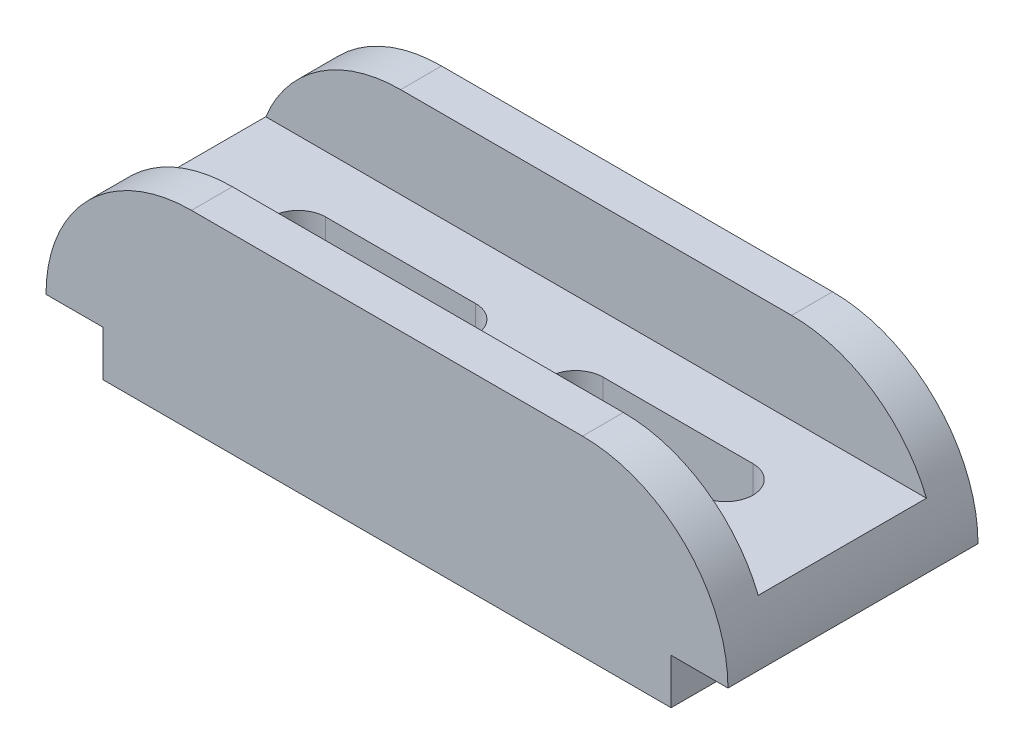
ISO-10303-21;
HEADER;
FILE_DESCRIPTION(('STEP AP214'),'2;1');
FILE_NAME('part.step','',(''),(''),'','','');
FILE_SCHEMA(('AUTOMOTIVE_DESIGN { 1 0 10303 214 1 1 1 1 }'));
ENDSEC;
DATA;
#1=APPLICATION_CONTEXT('core data for automotive mechanical design processes');
#2=APPLICATION_PROTOCOL_DEFINITION('international standard','automotive_design',2000,#1);
#3=PRODUCT_CONTEXT('',#1,'mechanical');
#4=PRODUCT('Part','Part','',(#3));
#5=PRODUCT_RELATED_PRODUCT_CATEGORY('part','',(#4));
#6=PRODUCT_DEFINITION_FORMATION('','',#4);
#7=PRODUCT_DEFINITION_CONTEXT('part definition',#1,'design');
#8=PRODUCT_DEFINITION('design','',#6,#7);
#9=PRODUCT_DEFINITION_SHAPE('','',#8);
#10=(LENGTH_UNIT() NAMED_UNIT(*) SI_UNIT(.MILLI.,.METRE.));
#11=(NAMED_UNIT(*) PLANE_ANGLE_UNIT() SI_UNIT($,.RADIAN.));
#12=(NAMED_UNIT(*) SI_UNIT($,.STERADIAN.) SOLID_ANGLE_UNIT());
#13=UNCERTAINTY_MEASURE_WITH_UNIT(LENGTH_MEASURE(1.E-05),#10,'distance_accuracy_value','');
#14=(GEOMETRIC_REPRESENTATION_CONTEXT(3) GLOBAL_UNCERTAINTY_ASSIGNED_CONTEXT((#13)) GLOBAL_UNIT_ASSIGNED_CONTEXT((#10,
#11,#12)) REPRESENTATION_CONTEXT('',''));
#15=CARTESIAN_POINT('',(0.,0.,0.));
#16=DIRECTION('',(0.,0.,1.));
#17=DIRECTION('',(1.,0.,0.));
#18=AXIS2_PLACEMENT_3D('',#15,#16,#17);
#19=CARTESIAN_POINT('',(43.,42.,27.5));
#20=DIRECTION('',(0.,-1.,0.));
#21=DIRECTION('',(0.,0.,-1.));
#22=AXIS2_PLACEMENT_3D('',#19,#20,#21);
#23=PLANE('',#22);
#24=DIRECTION('',(1.,0.,0.));
#25=VECTOR('',#24,1.);
#26=CARTESIAN_POINT('',(-75.,42.,18.5));
#27=LINE('',#26,#25);
#28=CARTESIAN_POINT('',(-43.,42.,18.5));
#29=VERTEX_POINT('',#28);
#30=CARTESIAN_POINT('',(43.,42.,18.5));
#31=VERTEX_POINT('',#30);
#32=EDGE_CURVE('E218',#29,#31,#27,.T.);
#33=ORIENTED_EDGE('',*,*,#32,.F.);
#34=DIRECTION('',(0.,0.,-1.));
#35=VECTOR('',#34,1.);
#36=CARTESIAN_POINT('',(-43.,42.,27.5));
#37=LINE('',#36,#35);
#38=CARTESIAN_POINT('',(-43.,42.,27.5));
#39=VERTEX_POINT('',#38);
#40=EDGE_CURVE('E314',#39,#29,#37,.T.);
#41=ORIENTED_EDGE('',*,*,#40,.F.);
#42=DIRECTION('',(-1.,0.,0.));
#43=VECTOR('',#42,1.);
#44=CARTESIAN_POINT('',(43.,42.,27.5));
#45=LINE('',#44,#43);
#46=CARTESIAN_POINT('',(43.,42.,27.5));
#47=VERTEX_POINT('',#46);
#48=EDGE_CURVE('E273',#47,#39,#45,.T.);
#49=ORIENTED_EDGE('',*,*,#48,.F.);
#50=DIRECTION('',(0.,0.,-1.));
#51=VECTOR('',#50,1.);
#52=CARTESIAN_POINT('',(43.,42.,27.5));
#53=LINE('',#52,#51);
#54=EDGE_CURVE('E318',#47,#31,#53,.T.);
#55=ORIENTED_EDGE('',*,*,#54,.T.);
#56=EDGE_LOOP('',(#33,#41,#49,#55));
#57=FACE_BOUND('',#56,.T.);
#58=ADVANCED_FACE('F39',(#57),#23,.F.);
#59=CARTESIAN_POINT('',(62.5,0.,27.5));
#60=DIRECTION('',(-1.,0.,0.));
#61=DIRECTION('',(0.,0.,1.));
#62=AXIS2_PLACEMENT_3D('',#59,#60,#61);
#63=PLANE('',#62);
#64=DIRECTION('',(0.,1.,0.));
#65=VECTOR('',#64,1.);
#66=CARTESIAN_POINT('',(62.5,0.,-27.5));
#67=LINE('',#66,#65);
#68=CARTESIAN_POINT('',(62.5,0.,-27.5));
#69=VERTEX_POINT('',#68);
#70=CARTESIAN_POINT('',(62.5,10.,-27.5));
#71=VERTEX_POINT('',#70);
#72=EDGE_CURVE('E264',#69,#71,#67,.T.);
#73=ORIENTED_EDGE('',*,*,#72,.T.);
#74=DIRECTION('',(0.,0.,-1.));
#75=VECTOR('',#74,1.);
#76=CARTESIAN_POINT('',(62.5,10.,27.5));
#77=LINE('',#76,#75);
#78=CARTESIAN_POINT('',(62.5,10.,27.5));
#79=VERTEX_POINT('',#78);
#80=EDGE_CURVE('E322',#79,#71,#77,.T.);
#81=ORIENTED_EDGE('',*,*,#80,.F.);
#82=DIRECTION('',(0.,1.,0.));
#83=VECTOR('',#82,1.);
#84=CARTESIAN_POINT('',(62.5,0.,27.5));
#85=LINE('',#84,#83);
#86=CARTESIAN_POINT('',(62.5,0.,27.5));
#87=VERTEX_POINT('',#86);
#88=EDGE_CURVE('E266',#87,#79,#85,.T.);
#89=ORIENTED_EDGE('',*,*,#88,.F.);
#90=DIRECTION('',(0.,0.,-1.));
#91=VECTOR('',#90,1.);
#92=CARTESIAN_POINT('',(62.5,0.,27.5));
#93=LINE('',#92,#91);
#94=EDGE_CURVE('E281',#87,#69,#93,.T.);
#95=ORIENTED_EDGE('',*,*,#94,.T.);
#96=EDGE_LOOP('',(#73,#81,#89,#95));
#97=FACE_BOUND('',#96,.T.);
#98=ADVANCED_FACE('F41',(#97),#63,.F.);
#99=CARTESIAN_POINT('',(62.5,10.,27.5));
#100=DIRECTION('',(0.,1.,0.));
#101=DIRECTION('',(0.,0.,1.));
#102=AXIS2_PLACEMENT_3D('',#99,#100,#101);
#103=PLANE('',#102);
#104=DIRECTION('',(1.,0.,0.));
#105=VECTOR('',#104,1.);
#106=CARTESIAN_POINT('',(62.5,10.,-27.5));
#107=LINE('',#106,#105);
#108=CARTESIAN_POINT('',(75.,10.,-27.5));
#109=VERTEX_POINT('',#108);
#110=EDGE_CURVE('E287',#71,#109,#107,.T.);
#111=ORIENTED_EDGE('',*,*,#110,.T.);
#112=DIRECTION('',(0.,0.,-1.));
#113=VECTOR('',#112,1.);
#114=CARTESIAN_POINT('',(75.,10.,27.5));
#115=LINE('',#114,#113);
#116=CARTESIAN_POINT('',(75.,10.,27.5));
#117=VERTEX_POINT('',#116);
#118=EDGE_CURVE('E321',#117,#109,#115,.T.);
#119=ORIENTED_EDGE('',*,*,#118,.F.);
#120=DIRECTION('',(1.,0.,0.));
#121=VECTOR('',#120,1.);
#122=CARTESIAN_POINT('',(62.5,10.,27.5));
#123=LINE('',#122,#121);
#124=EDGE_CURVE('E267',#79,#117,#123,.T.);
#125=ORIENTED_EDGE('',*,*,#124,.F.);
#126=ORIENTED_EDGE('',*,*,#80,.T.);
#127=EDGE_LOOP('',(#111,#119,#125,#126));
#128=FACE_BOUND('',#127,.T.);
#129=ADVANCED_FACE('F379',(#128),#103,.F.);
#130=CARTESIAN_POINT('',(43.,10.,27.5));
#131=DIRECTION('',(0.,0.,-1.));
#132=DIRECTION('',(-1.,0.,0.));
#133=AXIS2_PLACEMENT_3D('',#130,#131,#132);
#134=CYLINDRICAL_SURFACE('',#133,32.);
#135=CARTESIAN_POINT('',(43.,42.,-18.5));
#136=VERTEX_POINT('',#135);
#137=CARTESIAN_POINT('',(43.,42.,-27.5));
#138=VERTEX_POINT('',#137);
#139=EDGE_CURVE('E320',#136,#138,#53,.T.);
#140=ORIENTED_EDGE('',*,*,#139,.F.);
#141=CARTESIAN_POINT('',(43.,10.,-18.5));
#142=DIRECTION('',(0.,0.,-1.));
#143=DIRECTION('',(0.,1.,0.));
#144=AXIS2_PLACEMENT_3D('',#141,#142,#143);
#145=CIRCLE('',#144,32.);
#146=CARTESIAN_POINT('',(72.6647939483826,22.,-18.5));
#147=VERTEX_POINT('',#146);
#148=EDGE_CURVE('E265',#136,#147,#145,.T.);
#149=ORIENTED_EDGE('',*,*,#148,.T.);
#150=DIRECTION('',(0.,0.,-1.));
#151=VECTOR('',#150,1.);
#152=CARTESIAN_POINT('',(72.6647939483826,22.,27.5));
#153=LINE('',#152,#151);
#154=CARTESIAN_POINT('',(72.6647939483826,22.,18.5));
#155=VERTEX_POINT('',#154);
#156=EDGE_CURVE('E259',#147,#155,#153,.F.);
#157=ORIENTED_EDGE('',*,*,#156,.T.);
#158=CARTESIAN_POINT('',(43.,10.,18.5));
#159=DIRECTION('',(0.,0.,1.));
#160=DIRECTION('',(0.,-1.,0.));
#161=AXIS2_PLACEMENT_3D('',#158,#159,#160);
#162=CIRCLE('',#161,32.);
#163=EDGE_CURVE('E248',#155,#31,#162,.T.);
#164=ORIENTED_EDGE('',*,*,#163,.T.);
#165=ORIENTED_EDGE('',*,*,#54,.F.);
#166=CARTESIAN_POINT('',(43.,10.,27.5));
#167=DIRECTION('',(0.,0.,1.));
#168=DIRECTION('',(1.,0.,0.));
#169=AXIS2_PLACEMENT_3D('',#166,#167,#168);
#170=CIRCLE('',#169,32.);
#171=EDGE_CURVE('E275',#117,#47,#170,.T.);
#172=ORIENTED_EDGE('',*,*,#171,.F.);
#173=ORIENTED_EDGE('',*,*,#118,.T.);
#174=CARTESIAN_POINT('',(43.,10.,-27.5));
#175=DIRECTION('',(0.,0.,1.));
#176=DIRECTION('',(1.,0.,0.));
#177=AXIS2_PLACEMENT_3D('',#174,#175,#176);
#178=CIRCLE('',#177,32.);
#179=EDGE_CURVE('E288',#109,#138,#178,.T.);
#180=ORIENTED_EDGE('',*,*,#179,.T.);
#181=EDGE_LOOP('',(#140,#149,#157,#164,#165,#172,#173,#180));
#182=FACE_BOUND('',#181,.T.);
#183=ADVANCED_FACE('F338',(#182),#134,.T.);
#184=CARTESIAN_POINT('',(-43.,42.,-18.5));
#185=VERTEX_POINT('',#184);
#186=CARTESIAN_POINT('',(-43.,42.,-27.5));
#187=VERTEX_POINT('',#186);
#188=EDGE_CURVE('E311',#185,#187,#37,.T.);
#189=ORIENTED_EDGE('',*,*,#188,.F.);
#190=DIRECTION('',(1.,0.,0.));
#191=VECTOR('',#190,1.);
#192=CARTESIAN_POINT('',(-75.,42.,-18.5));
#193=LINE('',#192,#191);
#194=EDGE_CURVE('E246',#185,#136,#193,.T.);
#195=ORIENTED_EDGE('',*,*,#194,.T.);
#196=ORIENTED_EDGE('',*,*,#139,.T.);
#197=DIRECTION('',(-1.,0.,0.));
#198=VECTOR('',#197,1.);
#199=CARTESIAN_POINT('',(43.,42.,-27.5));
#200=LINE('',#199,#198);
#201=EDGE_CURVE('E295',#138,#187,#200,.T.);
#202=ORIENTED_EDGE('',*,*,#201,.T.);
#203=EDGE_LOOP('',(#189,#195,#196,#202));
#204=FACE_BOUND('',#203,.T.);
#205=ADVANCED_FACE('F343',(#204),#23,.F.);
#206=CARTESIAN_POINT('',(-43.,10.,27.5));
#207=DIRECTION('',(0.,0.,-1.));
#208=DIRECTION('',(-1.,0.,0.));
#209=AXIS2_PLACEMENT_3D('',#206,#207,#208);
#210=CYLINDRICAL_SURFACE('',#209,32.);
#211=DIRECTION('',(0.,0.,-1.));
#212=VECTOR('',#211,1.);
#213=CARTESIAN_POINT('',(-72.6647939483826,22.,27.5));
#214=LINE('',#213,#212);
#215=CARTESIAN_POINT('',(-72.6647939483826,22.,18.5));
#216=VERTEX_POINT('',#215);
#217=CARTESIAN_POINT('',(-72.6647939483826,22.,-18.5));
#218=VERTEX_POINT('',#217);
#219=EDGE_CURVE('E50',#216,#218,#214,.T.);
#220=ORIENTED_EDGE('',*,*,#219,.T.);
#221=CARTESIAN_POINT('',(-43.,10.,-18.5));
#222=DIRECTION('',(0.,0.,-1.));
#223=DIRECTION('',(0.,1.,0.));
#224=AXIS2_PLACEMENT_3D('',#221,#222,#223);
#225=CIRCLE('',#224,32.);
#226=EDGE_CURVE('E11',#218,#185,#225,.T.);
#227=ORIENTED_EDGE('',*,*,#226,.T.);
#228=ORIENTED_EDGE('',*,*,#188,.T.);
#229=CARTESIAN_POINT('',(-43.,10.,-27.5));
#230=DIRECTION('',(0.,0.,1.));
#231=DIRECTION('',(-1.,0.,0.));
#232=AXIS2_PLACEMENT_3D('',#229,#230,#231);
#233=CIRCLE('',#232,32.);
#234=CARTESIAN_POINT('',(-75.,10.,-27.5));
#235=VERTEX_POINT('',#234);
#236=EDGE_CURVE('E293',#187,#235,#233,.T.);
#237=ORIENTED_EDGE('',*,*,#236,.T.);
#238=DIRECTION('',(0.,0.,-1.));
#239=VECTOR('',#238,1.);
#240=CARTESIAN_POINT('',(-75.,10.,27.5));
#241=LINE('',#240,#239);
#242=CARTESIAN_POINT('',(-75.,10.,27.5));
#243=VERTEX_POINT('',#242);
#244=EDGE_CURVE('E309',#243,#235,#241,.T.);
#245=ORIENTED_EDGE('',*,*,#244,.F.);
#246=CARTESIAN_POINT('',(-43.,10.,27.5));
#247=DIRECTION('',(0.,0.,1.));
#248=DIRECTION('',(-1.,0.,0.));
#249=AXIS2_PLACEMENT_3D('',#246,#247,#248);
#250=CIRCLE('',#249,32.);
#251=EDGE_CURVE('E277',#39,#243,#250,.T.);
#252=ORIENTED_EDGE('',*,*,#251,.F.);
#253=ORIENTED_EDGE('',*,*,#40,.T.);
#254=CARTESIAN_POINT('',(-43.,10.,18.5));
#255=DIRECTION('',(0.,0.,1.));
#256=DIRECTION('',(0.,-1.,0.));
#257=AXIS2_PLACEMENT_3D('',#254,#255,#256);
#258=CIRCLE('',#257,32.);
#259=EDGE_CURVE('E330',#29,#216,#258,.T.);
#260=ORIENTED_EDGE('',*,*,#259,.T.);
#261=EDGE_LOOP('',(#220,#227,#228,#237,#245,#252,#253,#260));
#262=FACE_BOUND('',#261,.T.);
#263=ADVANCED_FACE('F335',(#262),#210,.T.);
#264=CARTESIAN_POINT('',(-62.5,10.,27.5));
#265=DIRECTION('',(0.,1.,0.));
#266=DIRECTION('',(0.,0.,1.));
#267=AXIS2_PLACEMENT_3D('',#264,#265,#266);
#268=PLANE('',#267);
#269=DIRECTION('',(1.,0.,0.));
#270=VECTOR('',#269,1.);
#271=CARTESIAN_POINT('',(-62.5,10.,-27.5));
#272=LINE('',#271,#270);
#273=CARTESIAN_POINT('',(-62.5,10.,-27.5));
#274=VERTEX_POINT('',#273);
#275=EDGE_CURVE('E300',#235,#274,#272,.T.);
#276=ORIENTED_EDGE('',*,*,#275,.T.);
#277=DIRECTION('',(0.,0.,-1.));
#278=VECTOR('',#277,1.);
#279=CARTESIAN_POINT('',(-62.5,10.,27.5));
#280=LINE('',#279,#278);
#281=CARTESIAN_POINT('',(-62.5,10.,27.5));
#282=VERTEX_POINT('',#281);
#283=EDGE_CURVE('E307',#282,#274,#280,.T.);
#284=ORIENTED_EDGE('',*,*,#283,.F.);
#285=DIRECTION('',(1.,0.,0.));
#286=VECTOR('',#285,1.);
#287=CARTESIAN_POINT('',(-62.5,10.,27.5));
#288=LINE('',#287,#286);
#289=EDGE_CURVE('E279',#243,#282,#288,.T.);
#290=ORIENTED_EDGE('',*,*,#289,.F.);
#291=ORIENTED_EDGE('',*,*,#244,.T.);
#292=EDGE_LOOP('',(#276,#284,#290,#291));
#293=FACE_BOUND('',#292,.T.);
#294=ADVANCED_FACE('F355',(#293),#268,.F.);
#295=CARTESIAN_POINT('',(-62.5,0.,27.5));
#296=DIRECTION('',(1.,0.,0.));
#297=DIRECTION('',(0.,0.,-1.));
#298=AXIS2_PLACEMENT_3D('',#295,#296,#297);
#299=PLANE('',#298);
#300=DIRECTION('',(0.,-1.,0.));
#301=VECTOR('',#300,1.);
#302=CARTESIAN_POINT('',(-62.5,0.,-27.5));
#303=LINE('',#302,#301);
#304=CARTESIAN_POINT('',(-62.5,0.,-27.5));
#305=VERTEX_POINT('',#304);
#306=EDGE_CURVE('E296',#274,#305,#303,.T.);
#307=ORIENTED_EDGE('',*,*,#306,.T.);
#308=DIRECTION('',(0.,0.,-1.));
#309=VECTOR('',#308,1.);
#310=CARTESIAN_POINT('',(-62.5,0.,27.5));
#311=LINE('',#310,#309);
#312=CARTESIAN_POINT('',(-62.5,0.,27.5));
#313=VERTEX_POINT('',#312);
#314=EDGE_CURVE('E303',#313,#305,#311,.T.);
#315=ORIENTED_EDGE('',*,*,#314,.F.);
#316=DIRECTION('',(0.,-1.,0.));
#317=VECTOR('',#316,1.);
#318=CARTESIAN_POINT('',(-62.5,0.,27.5));
#319=LINE('',#318,#317);
#320=EDGE_CURVE('E278',#282,#313,#319,.T.);
#321=ORIENTED_EDGE('',*,*,#320,.F.);
#322=ORIENTED_EDGE('',*,*,#283,.T.);
#323=EDGE_LOOP('',(#307,#315,#321,#322));
#324=FACE_BOUND('',#323,.T.);
#325=ADVANCED_FACE('F360',(#324),#299,.F.);
#326=CARTESIAN_POINT('',(-62.5,0.,27.5));
#327=DIRECTION('',(0.,1.,0.));
#328=DIRECTION('',(0.,0.,1.));
#329=AXIS2_PLACEMENT_3D('',#326,#327,#328);
#330=PLANE('',#329);
#331=DIRECTION('',(-1.,0.,0.));
#332=VECTOR('',#331,1.);
#333=CARTESIAN_POINT('',(-14.,0.,6.));
#334=LINE('',#333,#332);
#335=CARTESIAN_POINT('',(-14.,0.,6.));
#336=VERTEX_POINT('',#335);
#337=CARTESIAN_POINT('',(-47.,0.,6.));
#338=VERTEX_POINT('',#337);
#339=EDGE_CURVE('E207',#336,#338,#334,.T.);
#340=ORIENTED_EDGE('',*,*,#339,.F.);
#341=CARTESIAN_POINT('',(-14.,0.,0.));
#342=DIRECTION('',(0.,1.,0.));
#343=DIRECTION('',(0.,0.,1.));
#344=AXIS2_PLACEMENT_3D('',#341,#342,#343);
#345=CIRCLE('',#344,6.);
#346=CARTESIAN_POINT('',(-14.,0.,-6.));
#347=VERTEX_POINT('',#346);
#348=EDGE_CURVE('E215',#347,#336,#345,.F.);
#349=ORIENTED_EDGE('',*,*,#348,.F.);
#350=DIRECTION('',(1.,0.,0.));
#351=VECTOR('',#350,1.);
#352=CARTESIAN_POINT('',(-14.,0.,-6.));
#353=LINE('',#352,#351);
#354=CARTESIAN_POINT('',(-47.,0.,-6.));
#355=VERTEX_POINT('',#354);
#356=EDGE_CURVE('E192',#355,#347,#353,.T.);
#357=ORIENTED_EDGE('',*,*,#356,.F.);
#358=CARTESIAN_POINT('',(-47.,0.,0.));
#359=DIRECTION('',(0.,1.,0.));
#360=DIRECTION('',(0.,0.,1.));
#361=AXIS2_PLACEMENT_3D('',#358,#359,#360);
#362=CIRCLE('',#361,6.);
#363=EDGE_CURVE('E53',#338,#355,#362,.F.);
#364=ORIENTED_EDGE('',*,*,#363,.F.);
#365=EDGE_LOOP('',(#340,#349,#357,#364));
#366=FACE_BOUND('',#365,.T.);
#367=DIRECTION('',(1.,0.,0.));
#368=VECTOR('',#367,1.);
#369=CARTESIAN_POINT('',(14.,0.,-6.));
#370=LINE('',#369,#368);
#371=CARTESIAN_POINT('',(14.,0.,-6.));
#372=VERTEX_POINT('',#371);
#373=CARTESIAN_POINT('',(47.,0.,-6.));
#374=VERTEX_POINT('',#373);
#375=EDGE_CURVE('E236',#372,#374,#370,.T.);
#376=ORIENTED_EDGE('',*,*,#375,.F.);
#377=CARTESIAN_POINT('',(14.,0.,0.));
#378=DIRECTION('',(0.,1.,0.));
#379=DIRECTION('',(0.,0.,1.));
#380=AXIS2_PLACEMENT_3D('',#377,#378,#379);
#381=CIRCLE('',#380,6.);
#382=CARTESIAN_POINT('',(14.,0.,6.));
#383=VERTEX_POINT('',#382);
#384=EDGE_CURVE('E228',#383,#372,#381,.F.);
#385=ORIENTED_EDGE('',*,*,#384,.F.);
#386=DIRECTION('',(-1.,0.,0.));
#387=VECTOR('',#386,1.);
#388=CARTESIAN_POINT('',(14.,0.,6.));
#389=LINE('',#388,#387);
#390=CARTESIAN_POINT('',(47.,0.,6.));
#391=VERTEX_POINT('',#390);
#392=EDGE_CURVE('E219',#391,#383,#389,.T.);
#393=ORIENTED_EDGE('',*,*,#392,.F.);
#394=CARTESIAN_POINT('',(47.,0.,0.));
#395=DIRECTION('',(0.,1.,0.));
#396=DIRECTION('',(0.,0.,1.));
#397=AXIS2_PLACEMENT_3D('',#394,#395,#396);
#398=CIRCLE('',#397,6.);
#399=EDGE_CURVE('E65',#374,#391,#398,.F.);
#400=ORIENTED_EDGE('',*,*,#399,.F.);
#401=EDGE_LOOP('',(#376,#385,#393,#400));
#402=FACE_BOUND('',#401,.T.);
#403=DIRECTION('',(1.,0.,0.));
#404=VECTOR('',#403,1.);
#405=CARTESIAN_POINT('',(-62.5,0.,-27.5));
#406=LINE('',#405,#404);
#407=EDGE_CURVE('E269',#305,#69,#406,.T.);
#408=ORIENTED_EDGE('',*,*,#407,.T.);
#409=ORIENTED_EDGE('',*,*,#94,.F.);
#410=DIRECTION('',(1.,0.,0.));
#411=VECTOR('',#410,1.);
#412=CARTESIAN_POINT('',(-62.5,0.,27.5));
#413=LINE('',#412,#411);
#414=EDGE_CURVE('E285',#313,#87,#413,.T.);
#415=ORIENTED_EDGE('',*,*,#414,.F.);
#416=ORIENTED_EDGE('',*,*,#314,.T.);
#417=EDGE_LOOP('',(#408,#409,#415,#416));
#418=FACE_BOUND('',#417,.T.);
#419=ADVANCED_FACE('F365',(#366,#402,#418),#330,.F.);
#420=CARTESIAN_POINT('',(43.,10.,27.5));
#421=DIRECTION('',(0.,0.,1.));
#422=DIRECTION('',(1.,0.,0.));
#423=AXIS2_PLACEMENT_3D('',#420,#421,#422);
#424=PLANE('',#423);
#425=ORIENTED_EDGE('',*,*,#88,.T.);
#426=ORIENTED_EDGE('',*,*,#124,.T.);
#427=ORIENTED_EDGE('',*,*,#171,.T.);
#428=ORIENTED_EDGE('',*,*,#48,.T.);
#429=ORIENTED_EDGE('',*,*,#251,.T.);
#430=ORIENTED_EDGE('',*,*,#289,.T.);
#431=ORIENTED_EDGE('',*,*,#320,.T.);
#432=ORIENTED_EDGE('',*,*,#414,.T.);
#433=EDGE_LOOP('',(#425,#426,#427,#428,#429,#430,#431,#432));
#434=FACE_BOUND('',#433,.T.);
#435=ADVANCED_FACE('F366',(#434),#424,.T.);
#436=CARTESIAN_POINT('',(43.,10.,-27.5));
#437=DIRECTION('',(0.,0.,1.));
#438=DIRECTION('',(1.,0.,0.));
#439=AXIS2_PLACEMENT_3D('',#436,#437,#438);
#440=PLANE('',#439);
#441=ORIENTED_EDGE('',*,*,#72,.F.);
#442=ORIENTED_EDGE('',*,*,#407,.F.);
#443=ORIENTED_EDGE('',*,*,#306,.F.);
#444=ORIENTED_EDGE('',*,*,#275,.F.);
#445=ORIENTED_EDGE('',*,*,#236,.F.);
#446=ORIENTED_EDGE('',*,*,#201,.F.);
#447=ORIENTED_EDGE('',*,*,#179,.F.);
#448=ORIENTED_EDGE('',*,*,#110,.F.);
#449=EDGE_LOOP('',(#441,#442,#443,#444,#445,#446,#447,#448));
#450=FACE_BOUND('',#449,.T.);
#451=ADVANCED_FACE('F356',(#450),#440,.F.);
#452=CARTESIAN_POINT('',(-75.,42.,-18.5));
#453=DIRECTION('',(0.,0.,-1.));
#454=DIRECTION('',(0.,1.,0.));
#455=AXIS2_PLACEMENT_3D('',#452,#453,#454);
#456=PLANE('',#455);
#457=ORIENTED_EDGE('',*,*,#194,.F.);
#458=ORIENTED_EDGE('',*,*,#226,.F.);
#459=DIRECTION('',(1.,0.,0.));
#460=VECTOR('',#459,1.);
#461=CARTESIAN_POINT('',(-75.,22.,-18.5));
#462=LINE('',#461,#460);
#463=EDGE_CURVE('E250',#218,#147,#462,.T.);
#464=ORIENTED_EDGE('',*,*,#463,.T.);
#465=ORIENTED_EDGE('',*,*,#148,.F.);
#466=EDGE_LOOP('',(#457,#458,#464,#465));
#467=FACE_BOUND('',#466,.T.);
#468=ADVANCED_FACE('F340',(#467),#456,.F.);
#469=CARTESIAN_POINT('',(-75.,22.,-18.5));
#470=DIRECTION('',(0.,-1.,0.));
#471=DIRECTION('',(0.,0.,-1.));
#472=AXIS2_PLACEMENT_3D('',#469,#470,#471);
#473=PLANE('',#472);
#474=DIRECTION('',(-1.,0.,0.));
#475=VECTOR('',#474,1.);
#476=CARTESIAN_POINT('',(-14.,22.,-6.));
#477=LINE('',#476,#475);
#478=CARTESIAN_POINT('',(-14.,22.,-6.));
#479=VERTEX_POINT('',#478);
#480=CARTESIAN_POINT('',(-47.,22.,-6.));
#481=VERTEX_POINT('',#480);
#482=EDGE_CURVE('E189',#479,#481,#477,.T.);
#483=ORIENTED_EDGE('',*,*,#482,.F.);
#484=CARTESIAN_POINT('',(-14.,22.,0.));
#485=DIRECTION('',(0.,-1.,0.));
#486=DIRECTION('',(0.,0.,-1.));
#487=AXIS2_PLACEMENT_3D('',#484,#485,#486);
#488=CIRCLE('',#487,6.);
#489=CARTESIAN_POINT('',(-14.,22.,6.));
#490=VERTEX_POINT('',#489);
#491=EDGE_CURVE('E203',#490,#479,#488,.F.);
#492=ORIENTED_EDGE('',*,*,#491,.F.);
#493=DIRECTION('',(1.,0.,0.));
#494=VECTOR('',#493,1.);
#495=CARTESIAN_POINT('',(-14.,22.,6.));
#496=LINE('',#495,#494);
#497=CARTESIAN_POINT('',(-47.,22.,6.));
#498=VERTEX_POINT('',#497);
#499=EDGE_CURVE('E196',#498,#490,#496,.T.);
#500=ORIENTED_EDGE('',*,*,#499,.F.);
#501=CARTESIAN_POINT('',(-47.,22.,0.));
#502=DIRECTION('',(0.,-1.,0.));
#503=DIRECTION('',(0.,0.,-1.));
#504=AXIS2_PLACEMENT_3D('',#501,#502,#503);
#505=CIRCLE('',#504,6.);
#506=EDGE_CURVE('E179',#481,#498,#505,.F.);
#507=ORIENTED_EDGE('',*,*,#506,.F.);
#508=EDGE_LOOP('',(#483,#492,#500,#507));
#509=FACE_BOUND('',#508,.T.);
#510=DIRECTION('',(1.,0.,0.));
#511=VECTOR('',#510,1.);
#512=CARTESIAN_POINT('',(14.,22.,6.));
#513=LINE('',#512,#511);
#514=CARTESIAN_POINT('',(14.,22.,6.));
#515=VERTEX_POINT('',#514);
#516=CARTESIAN_POINT('',(47.,22.,6.));
#517=VERTEX_POINT('',#516);
#518=EDGE_CURVE('E224',#515,#517,#513,.T.);
#519=ORIENTED_EDGE('',*,*,#518,.F.);
#520=CARTESIAN_POINT('',(14.,22.,0.));
#521=DIRECTION('',(0.,-1.,0.));
#522=DIRECTION('',(0.,0.,-1.));
#523=AXIS2_PLACEMENT_3D('',#520,#521,#522);
#524=CIRCLE('',#523,6.);
#525=CARTESIAN_POINT('',(14.,22.,-6.));
#526=VERTEX_POINT('',#525);
#527=EDGE_CURVE('E245',#526,#515,#524,.F.);
#528=ORIENTED_EDGE('',*,*,#527,.F.);
#529=DIRECTION('',(-1.,0.,0.));
#530=VECTOR('',#529,1.);
#531=CARTESIAN_POINT('',(14.,22.,-6.));
#532=LINE('',#531,#530);
#533=CARTESIAN_POINT('',(47.,22.,-6.));
#534=VERTEX_POINT('',#533);
#535=EDGE_CURVE('E204',#534,#526,#532,.T.);
#536=ORIENTED_EDGE('',*,*,#535,.F.);
#537=CARTESIAN_POINT('',(47.,22.,0.));
#538=DIRECTION('',(0.,-1.,0.));
#539=DIRECTION('',(0.,0.,-1.));
#540=AXIS2_PLACEMENT_3D('',#537,#538,#539);
#541=CIRCLE('',#540,6.);
#542=EDGE_CURVE('E200',#517,#534,#541,.F.);
#543=ORIENTED_EDGE('',*,*,#542,.F.);
#544=EDGE_LOOP('',(#519,#528,#536,#543));
#545=FACE_BOUND('',#544,.T.);
#546=ORIENTED_EDGE('',*,*,#463,.F.);
#547=ORIENTED_EDGE('',*,*,#219,.F.);
#548=DIRECTION('',(1.,0.,0.));
#549=VECTOR('',#548,1.);
#550=CARTESIAN_POINT('',(-75.,22.,18.5));
#551=LINE('',#550,#549);
#552=EDGE_CURVE('E251',#216,#155,#551,.T.);
#553=ORIENTED_EDGE('',*,*,#552,.T.);
#554=ORIENTED_EDGE('',*,*,#156,.F.);
#555=EDGE_LOOP('',(#546,#547,#553,#554));
#556=FACE_BOUND('',#555,.T.);
#557=ADVANCED_FACE('F195',(#509,#545,#556),#473,.F.);
#558=CARTESIAN_POINT('',(-75.,22.,18.5));
#559=DIRECTION('',(0.,0.,1.));
#560=DIRECTION('',(0.,-1.,0.));
#561=AXIS2_PLACEMENT_3D('',#558,#559,#560);
#562=PLANE('',#561);
#563=ORIENTED_EDGE('',*,*,#552,.F.);
#564=ORIENTED_EDGE('',*,*,#259,.F.);
#565=ORIENTED_EDGE('',*,*,#32,.T.);
#566=ORIENTED_EDGE('',*,*,#163,.F.);
#567=EDGE_LOOP('',(#563,#564,#565,#566));
#568=FACE_BOUND('',#567,.T.);
#569=ADVANCED_FACE('F376',(#568),#562,.F.);
#570=CARTESIAN_POINT('',(14.,-0.001000000000001,0.));
#571=DIRECTION('',(0.,1.,0.));
#572=DIRECTION('',(0.,0.,1.));
#573=AXIS2_PLACEMENT_3D('',#570,#571,#572);
#574=CYLINDRICAL_SURFACE('',#573,6.);
#575=ORIENTED_EDGE('',*,*,#384,.T.);
#576=DIRECTION('',(0.,1.,0.));
#577=VECTOR('',#576,1.);
#578=CARTESIAN_POINT('',(14.,-0.001000000000001,-6.));
#579=LINE('',#578,#577);
#580=EDGE_CURVE('E227',#372,#526,#579,.T.);
#581=ORIENTED_EDGE('',*,*,#580,.T.);
#582=ORIENTED_EDGE('',*,*,#527,.T.);
#583=DIRECTION('',(0.,1.,0.));
#584=VECTOR('',#583,1.);
#585=CARTESIAN_POINT('',(14.,-0.001000000000001,6.));
#586=LINE('',#585,#584);
#587=EDGE_CURVE('E230',#383,#515,#586,.T.);
#588=ORIENTED_EDGE('',*,*,#587,.F.);
#589=EDGE_LOOP('',(#575,#581,#582,#588));
#590=FACE_BOUND('',#589,.T.);
#591=ADVANCED_FACE('F484',(#590),#574,.F.);
#592=CARTESIAN_POINT('',(14.,-0.001000000000001,-6.));
#593=DIRECTION('',(0.,0.,-1.));
#594=DIRECTION('',(-1.,0.,0.));
#595=AXIS2_PLACEMENT_3D('',#592,#593,#594);
#596=PLANE('',#595);
#597=ORIENTED_EDGE('',*,*,#375,.T.);
#598=DIRECTION('',(0.,1.,0.));
#599=VECTOR('',#598,1.);
#600=CARTESIAN_POINT('',(47.,-0.001000000000001,-6.));
#601=LINE('',#600,#599);
#602=EDGE_CURVE('E234',#374,#534,#601,.T.);
#603=ORIENTED_EDGE('',*,*,#602,.T.);
#604=ORIENTED_EDGE('',*,*,#535,.T.);
#605=ORIENTED_EDGE('',*,*,#580,.F.);
#606=EDGE_LOOP('',(#597,#603,#604,#605));
#607=FACE_BOUND('',#606,.T.);
#608=ADVANCED_FACE('F492',(#607),#596,.F.);
#609=CARTESIAN_POINT('',(47.,-0.001000000000001,0.));
#610=DIRECTION('',(0.,1.,0.));
#611=DIRECTION('',(0.,0.,1.));
#612=AXIS2_PLACEMENT_3D('',#609,#610,#611);
#613=CYLINDRICAL_SURFACE('',#612,6.);
#614=ORIENTED_EDGE('',*,*,#399,.T.);
#615=DIRECTION('',(0.,1.,0.));
#616=VECTOR('',#615,1.);
#617=CARTESIAN_POINT('',(47.,-0.001000000000001,6.));
#618=LINE('',#617,#616);
#619=EDGE_CURVE('E231',#391,#517,#618,.T.);
#620=ORIENTED_EDGE('',*,*,#619,.T.);
#621=ORIENTED_EDGE('',*,*,#542,.T.);
#622=ORIENTED_EDGE('',*,*,#602,.F.);
#623=EDGE_LOOP('',(#614,#620,#621,#622));
#624=FACE_BOUND('',#623,.T.);
#625=ADVANCED_FACE('F504',(#624),#613,.F.);
#626=CARTESIAN_POINT('',(14.,-0.001000000000001,6.));
#627=DIRECTION('',(0.,0.,1.));
#628=DIRECTION('',(1.,0.,0.));
#629=AXIS2_PLACEMENT_3D('',#626,#627,#628);
#630=PLANE('',#629);
#631=ORIENTED_EDGE('',*,*,#392,.T.);
#632=ORIENTED_EDGE('',*,*,#587,.T.);
#633=ORIENTED_EDGE('',*,*,#518,.T.);
#634=ORIENTED_EDGE('',*,*,#619,.F.);
#635=EDGE_LOOP('',(#631,#632,#633,#634));
#636=FACE_BOUND('',#635,.T.);
#637=ADVANCED_FACE('F511',(#636),#630,.F.);
#638=CARTESIAN_POINT('',(-14.,-0.001000000000001,0.));
#639=DIRECTION('',(0.,1.,0.));
#640=DIRECTION('',(0.,0.,1.));
#641=AXIS2_PLACEMENT_3D('',#638,#639,#640);
#642=CYLINDRICAL_SURFACE('',#641,6.);
#643=ORIENTED_EDGE('',*,*,#348,.T.);
#644=DIRECTION('',(0.,1.,0.));
#645=VECTOR('',#644,1.);
#646=CARTESIAN_POINT('',(-14.,-0.001000000000001,6.));
#647=LINE('',#646,#645);
#648=EDGE_CURVE('E194',#336,#490,#647,.T.);
#649=ORIENTED_EDGE('',*,*,#648,.T.);
#650=ORIENTED_EDGE('',*,*,#491,.T.);
#651=DIRECTION('',(0.,1.,0.));
#652=VECTOR('',#651,1.);
#653=CARTESIAN_POINT('',(-14.,-0.001000000000001,-6.));
#654=LINE('',#653,#652);
#655=EDGE_CURVE('E184',#347,#479,#654,.T.);
#656=ORIENTED_EDGE('',*,*,#655,.F.);
#657=EDGE_LOOP('',(#643,#649,#650,#656));
#658=FACE_BOUND('',#657,.T.);
#659=ADVANCED_FACE('F522',(#658),#642,.F.);
#660=CARTESIAN_POINT('',(-14.,-0.001000000000001,6.));
#661=DIRECTION('',(0.,0.,1.));
#662=DIRECTION('',(1.,0.,0.));
#663=AXIS2_PLACEMENT_3D('',#660,#661,#662);
#664=PLANE('',#663);
#665=ORIENTED_EDGE('',*,*,#339,.T.);
#666=DIRECTION('',(0.,1.,0.));
#667=VECTOR('',#666,1.);
#668=CARTESIAN_POINT('',(-47.,-0.001000000000001,6.));
#669=LINE('',#668,#667);
#670=EDGE_CURVE('E181',#338,#498,#669,.T.);
#671=ORIENTED_EDGE('',*,*,#670,.T.);
#672=ORIENTED_EDGE('',*,*,#499,.T.);
#673=ORIENTED_EDGE('',*,*,#648,.F.);
#674=EDGE_LOOP('',(#665,#671,#672,#673));
#675=FACE_BOUND('',#674,.T.);
#676=ADVANCED_FACE('F535',(#675),#664,.F.);
#677=CARTESIAN_POINT('',(-47.,-0.001000000000001,0.));
#678=DIRECTION('',(0.,1.,0.));
#679=DIRECTION('',(0.,0.,1.));
#680=AXIS2_PLACEMENT_3D('',#677,#678,#679);
#681=CYLINDRICAL_SURFACE('',#680,6.);
#682=ORIENTED_EDGE('',*,*,#363,.T.);
#683=DIRECTION('',(0.,1.,0.));
#684=VECTOR('',#683,1.);
#685=CARTESIAN_POINT('',(-47.,-0.001000000000001,-6.));
#686=LINE('',#685,#684);
#687=EDGE_CURVE('E171',#355,#481,#686,.T.);
#688=ORIENTED_EDGE('',*,*,#687,.T.);
#689=ORIENTED_EDGE('',*,*,#506,.T.);
#690=ORIENTED_EDGE('',*,*,#670,.F.);
#691=EDGE_LOOP('',(#682,#688,#689,#690));
#692=FACE_BOUND('',#691,.T.);
#693=ADVANCED_FACE('F176',(#692),#681,.F.);
#694=CARTESIAN_POINT('',(-14.,-0.001000000000001,-6.));
#695=DIRECTION('',(0.,0.,-1.));
#696=DIRECTION('',(-1.,0.,0.));
#697=AXIS2_PLACEMENT_3D('',#694,#695,#696);
#698=PLANE('',#697);
#699=ORIENTED_EDGE('',*,*,#356,.T.);
#700=ORIENTED_EDGE('',*,*,#655,.T.);
#701=ORIENTED_EDGE('',*,*,#482,.T.);
#702=ORIENTED_EDGE('',*,*,#687,.F.);
#703=EDGE_LOOP('',(#699,#700,#701,#702));
#704=FACE_BOUND('',#703,.T.);
#705=ADVANCED_FACE('F186',(#704),#698,.F.);
#706=CLOSED_SHELL('',(#58,#98,#129,#183,#205,#263,#294,#325,#419,#435,#451,#468,#557,#569,#591,
#608,#625,#637,#659,#676,#693,#705));
#707=MANIFOLD_SOLID_BREP('B2',#706);
#708=ADVANCED_BREP_SHAPE_REPRESENTATION('',(#18,#707),#14);
#709=SHAPE_DEFINITION_REPRESENTATION(#9,#708);
ENDSEC;
END-ISO-10303-21;
